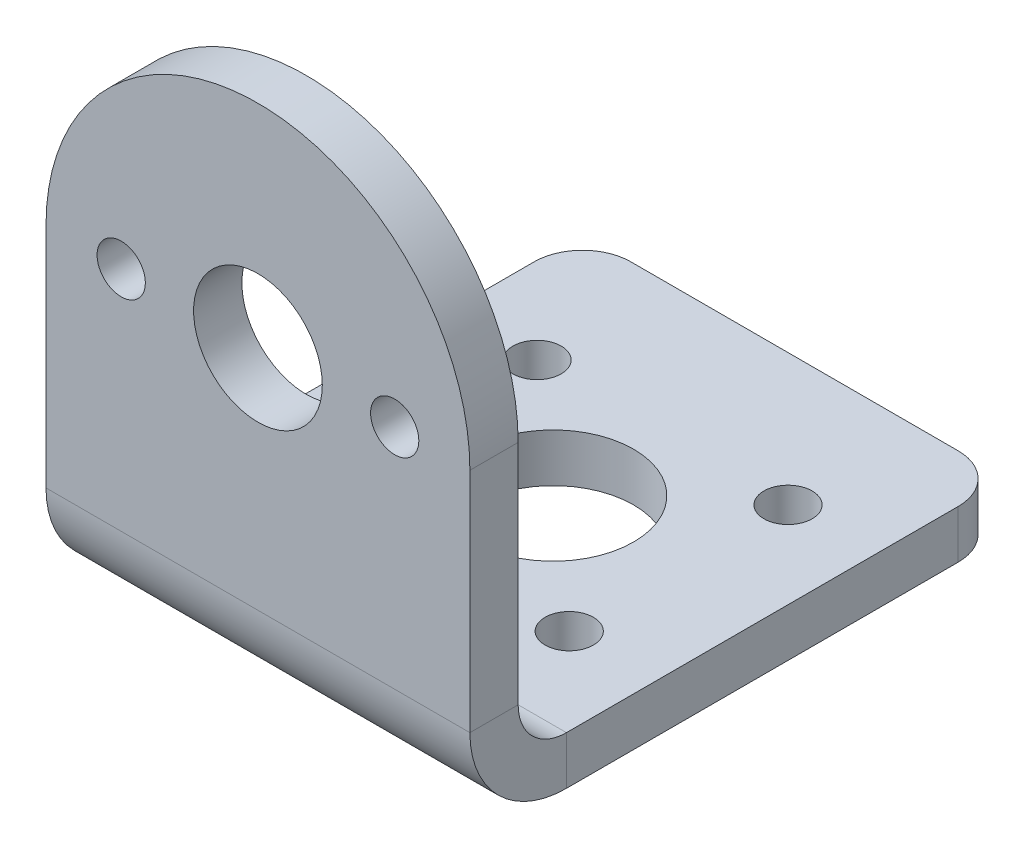
ISO-10303-21;
HEADER;
FILE_DESCRIPTION(('STEP AP214'),'2;1');
FILE_NAME('part.step','',(''),(''),'','','');
FILE_SCHEMA(('AUTOMOTIVE_DESIGN { 1 0 10303 214 1 1 1 1 }'));
ENDSEC;
DATA;
#1=APPLICATION_CONTEXT('core data for automotive mechanical design processes');
#2=APPLICATION_PROTOCOL_DEFINITION('international standard','automotive_design',2000,#1);
#3=PRODUCT_CONTEXT('',#1,'mechanical');
#4=PRODUCT('Part','Part','',(#3));
#5=PRODUCT_RELATED_PRODUCT_CATEGORY('part','',(#4));
#6=PRODUCT_DEFINITION_FORMATION('','',#4);
#7=PRODUCT_DEFINITION_CONTEXT('part definition',#1,'design');
#8=PRODUCT_DEFINITION('design','',#6,#7);
#9=PRODUCT_DEFINITION_SHAPE('','',#8);
#10=(LENGTH_UNIT() NAMED_UNIT(*) SI_UNIT(.MILLI.,.METRE.));
#11=(NAMED_UNIT(*) PLANE_ANGLE_UNIT() SI_UNIT($,.RADIAN.));
#12=(NAMED_UNIT(*) SI_UNIT($,.STERADIAN.) SOLID_ANGLE_UNIT());
#13=UNCERTAINTY_MEASURE_WITH_UNIT(LENGTH_MEASURE(1.E-05),#10,'distance_accuracy_value','');
#14=(GEOMETRIC_REPRESENTATION_CONTEXT(3) GLOBAL_UNCERTAINTY_ASSIGNED_CONTEXT((#13)) GLOBAL_UNIT_ASSIGNED_CONTEXT((#10,
#11,#12)) REPRESENTATION_CONTEXT('',''));
#15=CARTESIAN_POINT('',(0.,0.,0.));
#16=DIRECTION('',(0.,0.,1.));
#17=DIRECTION('',(1.,0.,0.));
#18=AXIS2_PLACEMENT_3D('',#15,#16,#17);
#19=CARTESIAN_POINT('',(0.,-5.76262106877346,0.));
#20=DIRECTION('',(0.,0.,1.));
#21=DIRECTION('',(1.,0.,0.));
#22=AXIS2_PLACEMENT_3D('',#19,#20,#21);
#23=PLANE('',#22);
#24=CARTESIAN_POINT('',(-8.5,0.,0.));
#25=DIRECTION('',(0.,0.,1.));
#26=DIRECTION('',(-1.,0.,0.));
#27=AXIS2_PLACEMENT_3D('',#24,#25,#26);
#28=CIRCLE('',#27,1.5);
#29=CARTESIAN_POINT('',(-7.,0.,0.));
#30=VERTEX_POINT('',#29);
#31=EDGE_CURVE('E410',#30,#30,#28,.T.);
#32=ORIENTED_EDGE('',*,*,#31,.T.);
#33=EDGE_LOOP('',(#32));
#34=FACE_BOUND('',#33,.T.);
#35=CARTESIAN_POINT('',(8.5,0.,0.));
#36=DIRECTION('',(0.,0.,1.));
#37=DIRECTION('',(-1.,0.,0.));
#38=AXIS2_PLACEMENT_3D('',#35,#36,#37);
#39=CIRCLE('',#38,1.5);
#40=CARTESIAN_POINT('',(10.,0.,0.));
#41=VERTEX_POINT('',#40);
#42=EDGE_CURVE('E395',#41,#41,#39,.T.);
#43=ORIENTED_EDGE('',*,*,#42,.T.);
#44=EDGE_LOOP('',(#43));
#45=FACE_BOUND('',#44,.T.);
#46=CARTESIAN_POINT('',(0.,0.,0.));
#47=DIRECTION('',(0.,0.,1.));
#48=DIRECTION('',(-1.,0.,0.));
#49=AXIS2_PLACEMENT_3D('',#46,#47,#48);
#50=CIRCLE('',#49,4.);
#51=CARTESIAN_POINT('',(4.,0.,0.));
#52=VERTEX_POINT('',#51);
#53=EDGE_CURVE('E278',#52,#52,#50,.T.);
#54=ORIENTED_EDGE('',*,*,#53,.T.);
#55=EDGE_LOOP('',(#54));
#56=FACE_BOUND('',#55,.T.);
#57=DIRECTION('',(-1.,0.,0.));
#58=VECTOR('',#57,1.);
#59=CARTESIAN_POINT('',(-6.5875,-14.125,0.));
#60=LINE('',#59,#58);
#61=CARTESIAN_POINT('',(13.175,-14.125,0.));
#62=VERTEX_POINT('',#61);
#63=CARTESIAN_POINT('',(-13.175,-14.125,0.));
#64=VERTEX_POINT('',#63);
#65=EDGE_CURVE('E309',#62,#64,#60,.T.);
#66=ORIENTED_EDGE('',*,*,#65,.T.);
#67=DIRECTION('',(0.,1.,0.));
#68=VECTOR('',#67,1.);
#69=CARTESIAN_POINT('',(-13.175,-20.125,0.));
#70=LINE('',#69,#68);
#71=CARTESIAN_POINT('',(-13.175,0.,0.));
#72=VERTEX_POINT('',#71);
#73=EDGE_CURVE('E284',#64,#72,#70,.T.);
#74=ORIENTED_EDGE('',*,*,#73,.T.);
#75=CARTESIAN_POINT('',(0.,0.,0.));
#76=DIRECTION('',(0.,0.,-1.));
#77=DIRECTION('',(-1.,0.,0.));
#78=AXIS2_PLACEMENT_3D('',#75,#76,#77);
#79=CIRCLE('',#78,13.175);
#80=CARTESIAN_POINT('',(13.175,0.,0.));
#81=VERTEX_POINT('',#80);
#82=EDGE_CURVE('E11',#72,#81,#79,.T.);
#83=ORIENTED_EDGE('',*,*,#82,.T.);
#84=DIRECTION('',(0.,-1.,0.));
#85=VECTOR('',#84,1.);
#86=CARTESIAN_POINT('',(13.175,0.,0.));
#87=LINE('',#86,#85);
#88=EDGE_CURVE('E372',#81,#62,#87,.T.);
#89=ORIENTED_EDGE('',*,*,#88,.T.);
#90=EDGE_LOOP('',(#66,#74,#83,#89));
#91=FACE_BOUND('',#90,.T.);
#92=ADVANCED_FACE('F17',(#34,#45,#56,#91),#23,.F.);
#93=CARTESIAN_POINT('',(0.,0.,0.));
#94=DIRECTION('',(0.,0.,1.));
#95=DIRECTION('',(-1.,0.,0.));
#96=AXIS2_PLACEMENT_3D('',#93,#94,#95);
#97=CYLINDRICAL_SURFACE('',#96,13.175);
#98=CARTESIAN_POINT('',(0.,0.,3.));
#99=DIRECTION('',(0.,0.,-1.));
#100=DIRECTION('',(-1.,0.,0.));
#101=AXIS2_PLACEMENT_3D('',#98,#99,#100);
#102=CIRCLE('',#101,13.175);
#103=CARTESIAN_POINT('',(-13.175,0.,3.));
#104=VERTEX_POINT('',#103);
#105=CARTESIAN_POINT('',(13.175,0.,3.));
#106=VERTEX_POINT('',#105);
#107=EDGE_CURVE('E283',#104,#106,#102,.T.);
#108=ORIENTED_EDGE('',*,*,#107,.T.);
#109=DIRECTION('',(0.,0.,1.));
#110=VECTOR('',#109,1.);
#111=CARTESIAN_POINT('',(13.175,0.,0.));
#112=LINE('',#111,#110);
#113=EDGE_CURVE('E28',#81,#106,#112,.T.);
#114=ORIENTED_EDGE('',*,*,#113,.F.);
#115=ORIENTED_EDGE('',*,*,#82,.F.);
#116=DIRECTION('',(0.,0.,1.));
#117=VECTOR('',#116,1.);
#118=CARTESIAN_POINT('',(-13.175,0.,0.));
#119=LINE('',#118,#117);
#120=EDGE_CURVE('E342',#72,#104,#119,.T.);
#121=ORIENTED_EDGE('',*,*,#120,.T.);
#122=EDGE_LOOP('',(#108,#114,#115,#121));
#123=FACE_BOUND('',#122,.T.);
#124=ADVANCED_FACE('F546',(#123),#97,.T.);
#125=CARTESIAN_POINT('',(13.175,0.,0.));
#126=DIRECTION('',(1.,0.,0.));
#127=DIRECTION('',(0.,1.,0.));
#128=AXIS2_PLACEMENT_3D('',#125,#126,#127);
#129=PLANE('',#128);
#130=DIRECTION('',(0.,0.,-1.));
#131=VECTOR('',#130,1.);
#132=CARTESIAN_POINT('',(13.175,-14.125,0.));
#133=LINE('',#132,#131);
#134=CARTESIAN_POINT('',(13.175,-14.125,3.));
#135=VERTEX_POINT('',#134);
#136=EDGE_CURVE('E314',#135,#62,#133,.T.);
#137=ORIENTED_EDGE('',*,*,#136,.T.);
#138=ORIENTED_EDGE('',*,*,#88,.F.);
#139=ORIENTED_EDGE('',*,*,#113,.T.);
#140=DIRECTION('',(0.,-1.,0.));
#141=VECTOR('',#140,1.);
#142=CARTESIAN_POINT('',(13.175,0.,3.));
#143=LINE('',#142,#141);
#144=EDGE_CURVE('E280',#106,#135,#143,.T.);
#145=ORIENTED_EDGE('',*,*,#144,.T.);
#146=EDGE_LOOP('',(#137,#138,#139,#145));
#147=FACE_BOUND('',#146,.T.);
#148=ADVANCED_FACE('F551',(#147),#129,.T.);
#149=CARTESIAN_POINT('',(-8.5,0.,0.));
#150=DIRECTION('',(0.,0.,1.));
#151=DIRECTION('',(-1.,0.,0.));
#152=AXIS2_PLACEMENT_3D('',#149,#150,#151);
#153=CYLINDRICAL_SURFACE('',#152,1.5);
#154=ORIENTED_EDGE('',*,*,#31,.F.);
#155=DIRECTION('',(0.,0.,1.));
#156=VECTOR('',#155,1.);
#157=CARTESIAN_POINT('',(-7.,0.,0.));
#158=LINE('',#157,#156);
#159=CARTESIAN_POINT('',(-7.,0.,3.));
#160=VERTEX_POINT('',#159);
#161=EDGE_CURVE('E121',#30,#160,#158,.T.);
#162=ORIENTED_EDGE('',*,*,#161,.T.);
#163=CARTESIAN_POINT('',(-8.5,0.,3.));
#164=DIRECTION('',(0.,0.,-1.));
#165=DIRECTION('',(-1.,0.,0.));
#166=AXIS2_PLACEMENT_3D('',#163,#164,#165);
#167=CIRCLE('',#166,1.5);
#168=EDGE_CURVE('E290',#160,#160,#167,.T.);
#169=ORIENTED_EDGE('',*,*,#168,.F.);
#170=ORIENTED_EDGE('',*,*,#161,.F.);
#171=EDGE_LOOP('',(#154,#162,#169,#170));
#172=FACE_BOUND('',#171,.T.);
#173=ADVANCED_FACE('F570',(#172),#153,.F.);
#174=CARTESIAN_POINT('',(8.5,0.,0.));
#175=DIRECTION('',(0.,0.,1.));
#176=DIRECTION('',(-1.,0.,0.));
#177=AXIS2_PLACEMENT_3D('',#174,#175,#176);
#178=CYLINDRICAL_SURFACE('',#177,1.5);
#179=ORIENTED_EDGE('',*,*,#42,.F.);
#180=DIRECTION('',(0.,0.,1.));
#181=VECTOR('',#180,1.);
#182=CARTESIAN_POINT('',(10.,0.,0.));
#183=LINE('',#182,#181);
#184=CARTESIAN_POINT('',(10.,0.,3.));
#185=VERTEX_POINT('',#184);
#186=EDGE_CURVE('E415',#41,#185,#183,.T.);
#187=ORIENTED_EDGE('',*,*,#186,.T.);
#188=CARTESIAN_POINT('',(8.5,0.,3.));
#189=DIRECTION('',(0.,0.,-1.));
#190=DIRECTION('',(-1.,0.,0.));
#191=AXIS2_PLACEMENT_3D('',#188,#189,#190);
#192=CIRCLE('',#191,1.5);
#193=EDGE_CURVE('E285',#185,#185,#192,.T.);
#194=ORIENTED_EDGE('',*,*,#193,.F.);
#195=ORIENTED_EDGE('',*,*,#186,.F.);
#196=EDGE_LOOP('',(#179,#187,#194,#195));
#197=FACE_BOUND('',#196,.T.);
#198=ADVANCED_FACE('F566',(#197),#178,.F.);
#199=CARTESIAN_POINT('',(0.,0.,0.));
#200=DIRECTION('',(0.,0.,1.));
#201=DIRECTION('',(-1.,0.,0.));
#202=AXIS2_PLACEMENT_3D('',#199,#200,#201);
#203=CYLINDRICAL_SURFACE('',#202,4.);
#204=ORIENTED_EDGE('',*,*,#53,.F.);
#205=DIRECTION('',(0.,0.,1.));
#206=VECTOR('',#205,1.);
#207=CARTESIAN_POINT('',(4.,0.,0.));
#208=LINE('',#207,#206);
#209=CARTESIAN_POINT('',(4.,0.,3.));
#210=VERTEX_POINT('',#209);
#211=EDGE_CURVE('E392',#52,#210,#208,.T.);
#212=ORIENTED_EDGE('',*,*,#211,.T.);
#213=CARTESIAN_POINT('',(0.,0.,3.));
#214=DIRECTION('',(0.,0.,-1.));
#215=DIRECTION('',(-1.,0.,0.));
#216=AXIS2_PLACEMENT_3D('',#213,#214,#215);
#217=CIRCLE('',#216,4.);
#218=EDGE_CURVE('E289',#210,#210,#217,.T.);
#219=ORIENTED_EDGE('',*,*,#218,.F.);
#220=ORIENTED_EDGE('',*,*,#211,.F.);
#221=EDGE_LOOP('',(#204,#212,#219,#220));
#222=FACE_BOUND('',#221,.T.);
#223=ADVANCED_FACE('F569',(#222),#203,.F.);
#224=CARTESIAN_POINT('',(0.,-5.76262106877346,3.));
#225=DIRECTION('',(0.,0.,1.));
#226=DIRECTION('',(1.,0.,0.));
#227=AXIS2_PLACEMENT_3D('',#224,#225,#226);
#228=PLANE('',#227);
#229=ORIENTED_EDGE('',*,*,#218,.T.);
#230=EDGE_LOOP('',(#229));
#231=FACE_BOUND('',#230,.T.);
#232=ORIENTED_EDGE('',*,*,#193,.T.);
#233=EDGE_LOOP('',(#232));
#234=FACE_BOUND('',#233,.T.);
#235=ORIENTED_EDGE('',*,*,#168,.T.);
#236=EDGE_LOOP('',(#235));
#237=FACE_BOUND('',#236,.T.);
#238=DIRECTION('',(1.,0.,0.));
#239=VECTOR('',#238,1.);
#240=CARTESIAN_POINT('',(-6.5875,-14.125,3.));
#241=LINE('',#240,#239);
#242=CARTESIAN_POINT('',(-13.175,-14.125,3.));
#243=VERTEX_POINT('',#242);
#244=EDGE_CURVE('E368',#243,#135,#241,.T.);
#245=ORIENTED_EDGE('',*,*,#244,.T.);
#246=ORIENTED_EDGE('',*,*,#144,.F.);
#247=ORIENTED_EDGE('',*,*,#107,.F.);
#248=DIRECTION('',(0.,1.,0.));
#249=VECTOR('',#248,1.);
#250=CARTESIAN_POINT('',(-13.175,-20.125,3.));
#251=LINE('',#250,#249);
#252=EDGE_CURVE('E349',#243,#104,#251,.T.);
#253=ORIENTED_EDGE('',*,*,#252,.F.);
#254=EDGE_LOOP('',(#245,#246,#247,#253));
#255=FACE_BOUND('',#254,.T.);
#256=ADVANCED_FACE('F705',(#231,#234,#237,#255),#228,.T.);
#257=CARTESIAN_POINT('',(-13.175,-20.125,0.));
#258=DIRECTION('',(-1.,0.,0.));
#259=DIRECTION('',(0.,0.,1.));
#260=AXIS2_PLACEMENT_3D('',#257,#258,#259);
#261=PLANE('',#260);
#262=DIRECTION('',(0.,0.,1.));
#263=VECTOR('',#262,1.);
#264=CARTESIAN_POINT('',(-13.175,-14.125,0.));
#265=LINE('',#264,#263);
#266=EDGE_CURVE('E310',#64,#243,#265,.T.);
#267=ORIENTED_EDGE('',*,*,#266,.T.);
#268=ORIENTED_EDGE('',*,*,#252,.T.);
#269=ORIENTED_EDGE('',*,*,#120,.F.);
#270=ORIENTED_EDGE('',*,*,#73,.F.);
#271=EDGE_LOOP('',(#267,#268,#269,#270));
#272=FACE_BOUND('',#271,.T.);
#273=ADVANCED_FACE('F521',(#272),#261,.T.);
#274=CARTESIAN_POINT('',(0.,-14.125,-3.));
#275=DIRECTION('',(1.,0.,0.));
#276=DIRECTION('',(0.,0.,1.));
#277=AXIS2_PLACEMENT_3D('',#274,#275,#276);
#278=CYLINDRICAL_SURFACE('',#277,3.);
#279=DIRECTION('',(1.,0.,0.));
#280=VECTOR('',#279,1.);
#281=CARTESIAN_POINT('',(0.,-17.125,-3.));
#282=LINE('',#281,#280);
#283=CARTESIAN_POINT('',(-13.175,-17.125,-3.));
#284=VERTEX_POINT('',#283);
#285=CARTESIAN_POINT('',(13.175,-17.125,-3.));
#286=VERTEX_POINT('',#285);
#287=EDGE_CURVE('E252',#284,#286,#282,.T.);
#288=ORIENTED_EDGE('',*,*,#287,.F.);
#289=CARTESIAN_POINT('',(-13.175,-14.125,-3.));
#290=DIRECTION('',(1.,0.,0.));
#291=DIRECTION('',(0.,0.,1.));
#292=AXIS2_PLACEMENT_3D('',#289,#290,#291);
#293=CIRCLE('',#292,3.);
#294=EDGE_CURVE('E149',#64,#284,#293,.T.);
#295=ORIENTED_EDGE('',*,*,#294,.F.);
#296=ORIENTED_EDGE('',*,*,#65,.F.);
#297=CARTESIAN_POINT('',(13.175,-14.125,-3.));
#298=DIRECTION('',(1.,0.,0.));
#299=DIRECTION('',(0.,0.,1.));
#300=AXIS2_PLACEMENT_3D('',#297,#298,#299);
#301=CIRCLE('',#300,3.);
#302=EDGE_CURVE('E311',#62,#286,#301,.T.);
#303=ORIENTED_EDGE('',*,*,#302,.T.);
#304=EDGE_LOOP('',(#288,#295,#296,#303));
#305=FACE_BOUND('',#304,.T.);
#306=ADVANCED_FACE('F506',(#305),#278,.F.);
#307=CARTESIAN_POINT('',(0.,-20.125,-13.282079934123));
#308=DIRECTION('',(0.,-1.,0.));
#309=DIRECTION('',(-1.,0.,0.));
#310=AXIS2_PLACEMENT_3D('',#307,#308,#309);
#311=PLANE('',#310);
#312=CARTESIAN_POINT('',(-7.8,-20.125,-8.55));
#313=DIRECTION('',(0.,1.,0.));
#314=DIRECTION('',(1.,0.,0.));
#315=AXIS2_PLACEMENT_3D('',#312,#313,#314);
#316=CIRCLE('',#315,1.5);
#317=CARTESIAN_POINT('',(-6.3,-20.125,-8.55));
#318=VERTEX_POINT('',#317);
#319=CARTESIAN_POINT('',(-9.3,-20.125,-8.55));
#320=VERTEX_POINT('',#319);
#321=EDGE_CURVE('E403',#318,#320,#316,.T.);
#322=ORIENTED_EDGE('',*,*,#321,.T.);
#323=CARTESIAN_POINT('',(-7.8,-20.125,-8.55));
#324=DIRECTION('',(0.,1.,0.));
#325=DIRECTION('',(1.,0.,0.));
#326=AXIS2_PLACEMENT_3D('',#323,#324,#325);
#327=CIRCLE('',#326,1.5);
#328=EDGE_CURVE('E436',#320,#318,#327,.T.);
#329=ORIENTED_EDGE('',*,*,#328,.T.);
#330=EDGE_LOOP('',(#322,#329));
#331=FACE_BOUND('',#330,.T.);
#332=CARTESIAN_POINT('',(7.8,-20.125,-22.15));
#333=DIRECTION('',(0.,1.,0.));
#334=DIRECTION('',(1.,0.,0.));
#335=AXIS2_PLACEMENT_3D('',#332,#333,#334);
#336=CIRCLE('',#335,1.5);
#337=CARTESIAN_POINT('',(9.3,-20.125,-22.15));
#338=VERTEX_POINT('',#337);
#339=CARTESIAN_POINT('',(6.3,-20.125,-22.15));
#340=VERTEX_POINT('',#339);
#341=EDGE_CURVE('E321',#338,#340,#336,.T.);
#342=ORIENTED_EDGE('',*,*,#341,.T.);
#343=CARTESIAN_POINT('',(7.8,-20.125,-22.15));
#344=DIRECTION('',(0.,1.,0.));
#345=DIRECTION('',(1.,0.,0.));
#346=AXIS2_PLACEMENT_3D('',#343,#344,#345);
#347=CIRCLE('',#346,1.5);
#348=EDGE_CURVE('E325',#340,#338,#347,.T.);
#349=ORIENTED_EDGE('',*,*,#348,.T.);
#350=EDGE_LOOP('',(#342,#349));
#351=FACE_BOUND('',#350,.T.);
#352=CARTESIAN_POINT('',(-7.8,-20.125,-22.15));
#353=DIRECTION('',(0.,1.,0.));
#354=DIRECTION('',(1.,0.,0.));
#355=AXIS2_PLACEMENT_3D('',#352,#353,#354);
#356=CIRCLE('',#355,1.5);
#357=CARTESIAN_POINT('',(-6.3,-20.125,-22.15));
#358=VERTEX_POINT('',#357);
#359=CARTESIAN_POINT('',(-9.3,-20.125,-22.15));
#360=VERTEX_POINT('',#359);
#361=EDGE_CURVE('E300',#358,#360,#356,.T.);
#362=ORIENTED_EDGE('',*,*,#361,.T.);
#363=CARTESIAN_POINT('',(-7.8,-20.125,-22.15));
#364=DIRECTION('',(0.,1.,0.));
#365=DIRECTION('',(1.,0.,0.));
#366=AXIS2_PLACEMENT_3D('',#363,#364,#365);
#367=CIRCLE('',#366,1.5);
#368=EDGE_CURVE('E296',#360,#358,#367,.T.);
#369=ORIENTED_EDGE('',*,*,#368,.T.);
#370=EDGE_LOOP('',(#362,#369));
#371=FACE_BOUND('',#370,.T.);
#372=CARTESIAN_POINT('',(7.8,-20.125,-8.55));
#373=DIRECTION('',(0.,1.,0.));
#374=DIRECTION('',(1.,0.,0.));
#375=AXIS2_PLACEMENT_3D('',#372,#373,#374);
#376=CIRCLE('',#375,1.5);
#377=CARTESIAN_POINT('',(9.3,-20.125,-8.55));
#378=VERTEX_POINT('',#377);
#379=CARTESIAN_POINT('',(6.3,-20.125,-8.55));
#380=VERTEX_POINT('',#379);
#381=EDGE_CURVE('E338',#378,#380,#376,.T.);
#382=ORIENTED_EDGE('',*,*,#381,.T.);
#383=CARTESIAN_POINT('',(7.8,-20.125,-8.55));
#384=DIRECTION('',(0.,1.,0.));
#385=DIRECTION('',(1.,0.,0.));
#386=AXIS2_PLACEMENT_3D('',#383,#384,#385);
#387=CIRCLE('',#386,1.5);
#388=EDGE_CURVE('E334',#380,#378,#387,.T.);
#389=ORIENTED_EDGE('',*,*,#388,.T.);
#390=EDGE_LOOP('',(#382,#389));
#391=FACE_BOUND('',#390,.T.);
#392=CARTESIAN_POINT('',(0.,-20.125,-15.35));
#393=DIRECTION('',(0.,1.,0.));
#394=DIRECTION('',(1.,0.,0.));
#395=AXIS2_PLACEMENT_3D('',#392,#393,#394);
#396=CIRCLE('',#395,5.);
#397=CARTESIAN_POINT('',(5.,-20.125,-15.35));
#398=VERTEX_POINT('',#397);
#399=CARTESIAN_POINT('',(-5.,-20.125,-15.35));
#400=VERTEX_POINT('',#399);
#401=EDGE_CURVE('E301',#398,#400,#396,.T.);
#402=ORIENTED_EDGE('',*,*,#401,.T.);
#403=CARTESIAN_POINT('',(0.,-20.125,-15.35));
#404=DIRECTION('',(0.,1.,0.));
#405=DIRECTION('',(1.,0.,0.));
#406=AXIS2_PLACEMENT_3D('',#403,#404,#405);
#407=CIRCLE('',#406,5.);
#408=EDGE_CURVE('E305',#400,#398,#407,.T.);
#409=ORIENTED_EDGE('',*,*,#408,.T.);
#410=EDGE_LOOP('',(#402,#409));
#411=FACE_BOUND('',#410,.T.);
#412=CARTESIAN_POINT('',(-10.175,-20.125,-27.35));
#413=DIRECTION('',(0.,1.,0.));
#414=DIRECTION('',(-0.707106781186549,0.,-0.707106781186546));
#415=AXIS2_PLACEMENT_3D('',#412,#413,#414);
#416=CIRCLE('',#415,3.);
#417=CARTESIAN_POINT('',(-10.175,-20.125,-30.35));
#418=VERTEX_POINT('',#417);
#419=CARTESIAN_POINT('',(-13.175,-20.125,-27.35));
#420=VERTEX_POINT('',#419);
#421=EDGE_CURVE('E268',#418,#420,#416,.T.);
#422=ORIENTED_EDGE('',*,*,#421,.F.);
#423=DIRECTION('',(-1.,0.,0.));
#424=VECTOR('',#423,1.);
#425=CARTESIAN_POINT('',(13.175,-20.125,-30.35));
#426=LINE('',#425,#424);
#427=CARTESIAN_POINT('',(10.175,-20.125,-30.35));
#428=VERTEX_POINT('',#427);
#429=EDGE_CURVE('E253',#428,#418,#426,.T.);
#430=ORIENTED_EDGE('',*,*,#429,.F.);
#431=CARTESIAN_POINT('',(10.175,-20.125,-27.35));
#432=DIRECTION('',(0.,1.,0.));
#433=DIRECTION('',(0.707106781186548,0.,-0.707106781186547));
#434=AXIS2_PLACEMENT_3D('',#431,#432,#433);
#435=CIRCLE('',#434,3.);
#436=CARTESIAN_POINT('',(13.175,-20.125,-27.35));
#437=VERTEX_POINT('',#436);
#438=EDGE_CURVE('E163',#437,#428,#435,.T.);
#439=ORIENTED_EDGE('',*,*,#438,.F.);
#440=DIRECTION('',(0.,0.,-1.));
#441=VECTOR('',#440,1.);
#442=CARTESIAN_POINT('',(13.175,-20.125,-3.));
#443=LINE('',#442,#441);
#444=CARTESIAN_POINT('',(13.175,-20.125,-3.));
#445=VERTEX_POINT('',#444);
#446=EDGE_CURVE('E319',#445,#437,#443,.T.);
#447=ORIENTED_EDGE('',*,*,#446,.F.);
#448=DIRECTION('',(-1.,0.,0.));
#449=VECTOR('',#448,1.);
#450=CARTESIAN_POINT('',(0.,-20.125,-3.));
#451=LINE('',#450,#449);
#452=CARTESIAN_POINT('',(-13.175,-20.125,-3.));
#453=VERTEX_POINT('',#452);
#454=EDGE_CURVE('E382',#445,#453,#451,.T.);
#455=ORIENTED_EDGE('',*,*,#454,.T.);
#456=DIRECTION('',(0.,0.,1.));
#457=VECTOR('',#456,1.);
#458=CARTESIAN_POINT('',(-13.175,-20.125,3.78584013175395));
#459=LINE('',#458,#457);
#460=EDGE_CURVE('E367',#420,#453,#459,.T.);
#461=ORIENTED_EDGE('',*,*,#460,.F.);
#462=EDGE_LOOP('',(#422,#430,#439,#447,#455,#461));
#463=FACE_BOUND('',#462,.T.);
#464=ADVANCED_FACE('F19',(#331,#351,#371,#391,#411,#463),#311,.T.);
#465=CARTESIAN_POINT('',(-13.175,-20.125,-3.));
#466=DIRECTION('',(-1.,0.,0.));
#467=DIRECTION('',(0.,0.,1.));
#468=AXIS2_PLACEMENT_3D('',#465,#466,#467);
#469=PLANE('',#468);
#470=DIRECTION('',(0.,1.,0.));
#471=VECTOR('',#470,1.);
#472=CARTESIAN_POINT('',(-13.175,-17.785,-3.));
#473=LINE('',#472,#471);
#474=EDGE_CURVE('E247',#453,#284,#473,.T.);
#475=ORIENTED_EDGE('',*,*,#474,.F.);
#476=CARTESIAN_POINT('',(-13.175,-14.125,-3.));
#477=DIRECTION('',(-1.,0.,0.));
#478=DIRECTION('',(0.,-1.,0.));
#479=AXIS2_PLACEMENT_3D('',#476,#477,#478);
#480=CIRCLE('',#479,6.);
#481=EDGE_CURVE('E363',#453,#243,#480,.T.);
#482=ORIENTED_EDGE('',*,*,#481,.T.);
#483=ORIENTED_EDGE('',*,*,#266,.F.);
#484=ORIENTED_EDGE('',*,*,#294,.T.);
#485=EDGE_LOOP('',(#475,#482,#483,#484));
#486=FACE_BOUND('',#485,.T.);
#487=ADVANCED_FACE('F505',(#486),#469,.T.);
#488=CARTESIAN_POINT('',(13.175,-17.125,-3.));
#489=DIRECTION('',(1.,0.,0.));
#490=DIRECTION('',(0.,1.,0.));
#491=AXIS2_PLACEMENT_3D('',#488,#489,#490);
#492=PLANE('',#491);
#493=DIRECTION('',(0.,-1.,0.));
#494=VECTOR('',#493,1.);
#495=CARTESIAN_POINT('',(13.175,-17.785,-3.));
#496=LINE('',#495,#494);
#497=EDGE_CURVE('E315',#286,#445,#496,.T.);
#498=ORIENTED_EDGE('',*,*,#497,.F.);
#499=ORIENTED_EDGE('',*,*,#302,.F.);
#500=ORIENTED_EDGE('',*,*,#136,.F.);
#501=CARTESIAN_POINT('',(13.175,-14.125,-3.));
#502=DIRECTION('',(1.,0.,0.));
#503=DIRECTION('',(0.,0.,1.));
#504=AXIS2_PLACEMENT_3D('',#501,#502,#503);
#505=CIRCLE('',#504,6.);
#506=EDGE_CURVE('E378',#135,#445,#505,.T.);
#507=ORIENTED_EDGE('',*,*,#506,.T.);
#508=EDGE_LOOP('',(#498,#499,#500,#507));
#509=FACE_BOUND('',#508,.T.);
#510=ADVANCED_FACE('F816',(#509),#492,.T.);
#511=CARTESIAN_POINT('',(-13.175,-17.125,-3.));
#512=DIRECTION('',(-1.,0.,0.));
#513=DIRECTION('',(0.,1.,0.));
#514=AXIS2_PLACEMENT_3D('',#511,#512,#513);
#515=PLANE('',#514);
#516=DIRECTION('',(0.,1.,0.));
#517=VECTOR('',#516,1.);
#518=CARTESIAN_POINT('',(-13.175,-17.125,-27.35));
#519=LINE('',#518,#517);
#520=CARTESIAN_POINT('',(-13.175,-17.125,-27.35));
#521=VERTEX_POINT('',#520);
#522=EDGE_CURVE('E245',#420,#521,#519,.T.);
#523=ORIENTED_EDGE('',*,*,#522,.F.);
#524=ORIENTED_EDGE('',*,*,#460,.T.);
#525=ORIENTED_EDGE('',*,*,#474,.T.);
#526=DIRECTION('',(0.,0.,-1.));
#527=VECTOR('',#526,1.);
#528=CARTESIAN_POINT('',(-13.175,-17.125,3.78584013175395));
#529=LINE('',#528,#527);
#530=EDGE_CURVE('E240',#284,#521,#529,.T.);
#531=ORIENTED_EDGE('',*,*,#530,.T.);
#532=EDGE_LOOP('',(#523,#524,#525,#531));
#533=FACE_BOUND('',#532,.T.);
#534=ADVANCED_FACE('F242',(#533),#515,.T.);
#535=CARTESIAN_POINT('',(0.,-14.125,-3.));
#536=DIRECTION('',(1.,0.,0.));
#537=DIRECTION('',(0.,0.,1.));
#538=AXIS2_PLACEMENT_3D('',#535,#536,#537);
#539=CYLINDRICAL_SURFACE('',#538,6.);
#540=ORIENTED_EDGE('',*,*,#454,.F.);
#541=ORIENTED_EDGE('',*,*,#506,.F.);
#542=ORIENTED_EDGE('',*,*,#244,.F.);
#543=ORIENTED_EDGE('',*,*,#481,.F.);
#544=EDGE_LOOP('',(#540,#541,#542,#543));
#545=FACE_BOUND('',#544,.T.);
#546=ADVANCED_FACE('F518',(#545),#539,.T.);
#547=CARTESIAN_POINT('',(-7.8,-18.625,-8.55));
#548=DIRECTION('',(0.,1.,0.));
#549=DIRECTION('',(1.,0.,0.));
#550=AXIS2_PLACEMENT_3D('',#547,#548,#549);
#551=CYLINDRICAL_SURFACE('',#550,1.5);
#552=CARTESIAN_POINT('',(-7.8,-17.125,-8.55));
#553=DIRECTION('',(0.,-1.,0.));
#554=DIRECTION('',(1.,0.,0.));
#555=AXIS2_PLACEMENT_3D('',#552,#553,#554);
#556=CIRCLE('',#555,1.5);
#557=CARTESIAN_POINT('',(-6.3,-17.125,-8.55));
#558=VERTEX_POINT('',#557);
#559=CARTESIAN_POINT('',(-9.3,-17.125,-8.55));
#560=VERTEX_POINT('',#559);
#561=EDGE_CURVE('E330',#558,#560,#556,.T.);
#562=ORIENTED_EDGE('',*,*,#561,.F.);
#563=CARTESIAN_POINT('',(-7.8,-17.125,-8.55));
#564=DIRECTION('',(0.,-1.,0.));
#565=DIRECTION('',(1.,0.,0.));
#566=AXIS2_PLACEMENT_3D('',#563,#564,#565);
#567=CIRCLE('',#566,1.5);
#568=EDGE_CURVE('E339',#560,#558,#567,.T.);
#569=ORIENTED_EDGE('',*,*,#568,.F.);
#570=DIRECTION('',(0.,-1.,0.));
#571=VECTOR('',#570,1.);
#572=CARTESIAN_POINT('',(-9.3,-18.625,-8.55));
#573=LINE('',#572,#571);
#574=EDGE_CURVE('E399',#560,#320,#573,.T.);
#575=ORIENTED_EDGE('',*,*,#574,.T.);
#576=ORIENTED_EDGE('',*,*,#321,.F.);
#577=ORIENTED_EDGE('',*,*,#328,.F.);
#578=ORIENTED_EDGE('',*,*,#574,.F.);
#579=EDGE_LOOP('',(#562,#569,#575,#576,#577,#578));
#580=FACE_BOUND('',#579,.T.);
#581=ADVANCED_FACE('F574',(#580),#551,.F.);
#582=CARTESIAN_POINT('',(7.8,-18.625,-22.15));
#583=DIRECTION('',(0.,1.,0.));
#584=DIRECTION('',(1.,0.,0.));
#585=AXIS2_PLACEMENT_3D('',#582,#583,#584);
#586=CYLINDRICAL_SURFACE('',#585,1.5);
#587=CARTESIAN_POINT('',(7.8,-17.125,-22.15));
#588=DIRECTION('',(0.,-1.,0.));
#589=DIRECTION('',(1.,0.,0.));
#590=AXIS2_PLACEMENT_3D('',#587,#588,#589);
#591=CIRCLE('',#590,1.5);
#592=CARTESIAN_POINT('',(9.3,-17.125,-22.15));
#593=VERTEX_POINT('',#592);
#594=CARTESIAN_POINT('',(6.3,-17.125,-22.15));
#595=VERTEX_POINT('',#594);
#596=EDGE_CURVE('E331',#593,#595,#591,.T.);
#597=ORIENTED_EDGE('',*,*,#596,.F.);
#598=CARTESIAN_POINT('',(7.8,-17.125,-22.15));
#599=DIRECTION('',(0.,-1.,0.));
#600=DIRECTION('',(1.,0.,0.));
#601=AXIS2_PLACEMENT_3D('',#598,#599,#600);
#602=CIRCLE('',#601,1.5);
#603=EDGE_CURVE('E326',#595,#593,#602,.T.);
#604=ORIENTED_EDGE('',*,*,#603,.F.);
#605=DIRECTION('',(0.,-1.,0.));
#606=VECTOR('',#605,1.);
#607=CARTESIAN_POINT('',(6.3,-18.625,-22.15));
#608=LINE('',#607,#606);
#609=EDGE_CURVE('E299',#595,#340,#608,.T.);
#610=ORIENTED_EDGE('',*,*,#609,.T.);
#611=ORIENTED_EDGE('',*,*,#341,.F.);
#612=ORIENTED_EDGE('',*,*,#348,.F.);
#613=ORIENTED_EDGE('',*,*,#609,.F.);
#614=EDGE_LOOP('',(#597,#604,#610,#611,#612,#613));
#615=FACE_BOUND('',#614,.T.);
#616=ADVANCED_FACE('F575',(#615),#586,.F.);
#617=CARTESIAN_POINT('',(-7.8,-18.625,-22.15));
#618=DIRECTION('',(0.,1.,0.));
#619=DIRECTION('',(1.,0.,0.));
#620=AXIS2_PLACEMENT_3D('',#617,#618,#619);
#621=CYLINDRICAL_SURFACE('',#620,1.5);
#622=CARTESIAN_POINT('',(-7.8,-17.125,-22.15));
#623=DIRECTION('',(0.,-1.,0.));
#624=DIRECTION('',(1.,0.,0.));
#625=AXIS2_PLACEMENT_3D('',#622,#623,#624);
#626=CIRCLE('',#625,1.5);
#627=CARTESIAN_POINT('',(-6.3,-17.125,-22.15));
#628=VERTEX_POINT('',#627);
#629=CARTESIAN_POINT('',(-9.3,-17.125,-22.15));
#630=VERTEX_POINT('',#629);
#631=EDGE_CURVE('E384',#628,#630,#626,.T.);
#632=ORIENTED_EDGE('',*,*,#631,.F.);
#633=CARTESIAN_POINT('',(-7.8,-17.125,-22.15));
#634=DIRECTION('',(0.,-1.,0.));
#635=DIRECTION('',(1.,0.,0.));
#636=AXIS2_PLACEMENT_3D('',#633,#634,#635);
#637=CIRCLE('',#636,1.5);
#638=EDGE_CURVE('E388',#630,#628,#637,.T.);
#639=ORIENTED_EDGE('',*,*,#638,.F.);
#640=DIRECTION('',(0.,-1.,0.));
#641=VECTOR('',#640,1.);
#642=CARTESIAN_POINT('',(-9.3,-18.625,-22.15));
#643=LINE('',#642,#641);
#644=EDGE_CURVE('E337',#630,#360,#643,.T.);
#645=ORIENTED_EDGE('',*,*,#644,.T.);
#646=ORIENTED_EDGE('',*,*,#361,.F.);
#647=ORIENTED_EDGE('',*,*,#368,.F.);
#648=ORIENTED_EDGE('',*,*,#644,.F.);
#649=EDGE_LOOP('',(#632,#639,#645,#646,#647,#648));
#650=FACE_BOUND('',#649,.T.);
#651=ADVANCED_FACE('F501',(#650),#621,.F.);
#652=CARTESIAN_POINT('',(7.8,-18.625,-8.55));
#653=DIRECTION('',(0.,1.,0.));
#654=DIRECTION('',(1.,0.,0.));
#655=AXIS2_PLACEMENT_3D('',#652,#653,#654);
#656=CYLINDRICAL_SURFACE('',#655,1.5);
#657=CARTESIAN_POINT('',(7.8,-17.125,-8.55));
#658=DIRECTION('',(0.,-1.,0.));
#659=DIRECTION('',(1.,0.,0.));
#660=AXIS2_PLACEMENT_3D('',#657,#658,#659);
#661=CIRCLE('',#660,1.5);
#662=CARTESIAN_POINT('',(9.3,-17.125,-8.55));
#663=VERTEX_POINT('',#662);
#664=CARTESIAN_POINT('',(6.3,-17.125,-8.55));
#665=VERTEX_POINT('',#664);
#666=EDGE_CURVE('E429',#663,#665,#661,.T.);
#667=ORIENTED_EDGE('',*,*,#666,.F.);
#668=CARTESIAN_POINT('',(7.8,-17.125,-8.55));
#669=DIRECTION('',(0.,-1.,0.));
#670=DIRECTION('',(1.,0.,0.));
#671=AXIS2_PLACEMENT_3D('',#668,#669,#670);
#672=CIRCLE('',#671,1.5);
#673=EDGE_CURVE('E389',#665,#663,#672,.T.);
#674=ORIENTED_EDGE('',*,*,#673,.F.);
#675=DIRECTION('',(0.,-1.,0.));
#676=VECTOR('',#675,1.);
#677=CARTESIAN_POINT('',(6.3,-18.625,-8.55));
#678=LINE('',#677,#676);
#679=EDGE_CURVE('E398',#665,#380,#678,.T.);
#680=ORIENTED_EDGE('',*,*,#679,.T.);
#681=ORIENTED_EDGE('',*,*,#381,.F.);
#682=ORIENTED_EDGE('',*,*,#388,.F.);
#683=ORIENTED_EDGE('',*,*,#679,.F.);
#684=EDGE_LOOP('',(#667,#674,#680,#681,#682,#683));
#685=FACE_BOUND('',#684,.T.);
#686=ADVANCED_FACE('F560',(#685),#656,.F.);
#687=CARTESIAN_POINT('',(0.,-18.625,-15.35));
#688=DIRECTION('',(0.,1.,0.));
#689=DIRECTION('',(1.,0.,0.));
#690=AXIS2_PLACEMENT_3D('',#687,#688,#689);
#691=CYLINDRICAL_SURFACE('',#690,5.);
#692=CARTESIAN_POINT('',(0.,-17.125,-15.35));
#693=DIRECTION('',(0.,-1.,0.));
#694=DIRECTION('',(1.,0.,0.));
#695=AXIS2_PLACEMENT_3D('',#692,#693,#694);
#696=CIRCLE('',#695,5.);
#697=CARTESIAN_POINT('',(5.,-17.125,-15.35));
#698=VERTEX_POINT('',#697);
#699=CARTESIAN_POINT('',(-5.,-17.125,-15.35));
#700=VERTEX_POINT('',#699);
#701=EDGE_CURVE('E445',#698,#700,#696,.T.);
#702=ORIENTED_EDGE('',*,*,#701,.F.);
#703=CARTESIAN_POINT('',(0.,-17.125,-15.35));
#704=DIRECTION('',(0.,-1.,0.));
#705=DIRECTION('',(1.,0.,0.));
#706=AXIS2_PLACEMENT_3D('',#703,#704,#705);
#707=CIRCLE('',#706,5.);
#708=EDGE_CURVE('E424',#700,#698,#707,.T.);
#709=ORIENTED_EDGE('',*,*,#708,.F.);
#710=DIRECTION('',(0.,-1.,0.));
#711=VECTOR('',#710,1.);
#712=CARTESIAN_POINT('',(-5.,-18.625,-15.35));
#713=LINE('',#712,#711);
#714=EDGE_CURVE('E306',#700,#400,#713,.T.);
#715=ORIENTED_EDGE('',*,*,#714,.T.);
#716=ORIENTED_EDGE('',*,*,#401,.F.);
#717=ORIENTED_EDGE('',*,*,#408,.F.);
#718=ORIENTED_EDGE('',*,*,#714,.F.);
#719=EDGE_LOOP('',(#702,#709,#715,#716,#717,#718));
#720=FACE_BOUND('',#719,.T.);
#721=ADVANCED_FACE('F558',(#720),#691,.F.);
#722=CARTESIAN_POINT('',(13.175,-17.125,-3.));
#723=DIRECTION('',(1.,0.,0.));
#724=DIRECTION('',(0.,1.,0.));
#725=AXIS2_PLACEMENT_3D('',#722,#723,#724);
#726=PLANE('',#725);
#727=DIRECTION('',(0.,-1.,0.));
#728=VECTOR('',#727,1.);
#729=CARTESIAN_POINT('',(13.175,-17.125,-27.35));
#730=LINE('',#729,#728);
#731=CARTESIAN_POINT('',(13.175,-17.125,-27.35));
#732=VERTEX_POINT('',#731);
#733=EDGE_CURVE('E320',#732,#437,#730,.T.);
#734=ORIENTED_EDGE('',*,*,#733,.F.);
#735=DIRECTION('',(0.,0.,-1.));
#736=VECTOR('',#735,1.);
#737=CARTESIAN_POINT('',(13.175,-17.125,3.78584013175395));
#738=LINE('',#737,#736);
#739=EDGE_CURVE('E291',#286,#732,#738,.T.);
#740=ORIENTED_EDGE('',*,*,#739,.F.);
#741=ORIENTED_EDGE('',*,*,#497,.T.);
#742=ORIENTED_EDGE('',*,*,#446,.T.);
#743=EDGE_LOOP('',(#734,#740,#741,#742));
#744=FACE_BOUND('',#743,.T.);
#745=ADVANCED_FACE('F528',(#744),#726,.T.);
#746=CARTESIAN_POINT('',(10.175,-17.125,-27.35));
#747=DIRECTION('',(0.,-1.,0.));
#748=DIRECTION('',(0.707106781186548,0.,-0.707106781186547));
#749=AXIS2_PLACEMENT_3D('',#746,#747,#748);
#750=CYLINDRICAL_SURFACE('',#749,3.);
#751=ORIENTED_EDGE('',*,*,#438,.T.);
#752=DIRECTION('',(0.,1.,0.));
#753=VECTOR('',#752,1.);
#754=CARTESIAN_POINT('',(10.175,-17.125,-30.35));
#755=LINE('',#754,#753);
#756=CARTESIAN_POINT('',(10.175,-17.125,-30.35));
#757=VERTEX_POINT('',#756);
#758=EDGE_CURVE('E21',#428,#757,#755,.T.);
#759=ORIENTED_EDGE('',*,*,#758,.T.);
#760=CARTESIAN_POINT('',(10.175,-17.125,-27.35));
#761=DIRECTION('',(0.,-1.,0.));
#762=DIRECTION('',(0.707106781186548,0.,-0.707106781186547));
#763=AXIS2_PLACEMENT_3D('',#760,#761,#762);
#764=CIRCLE('',#763,3.);
#765=EDGE_CURVE('E295',#757,#732,#764,.T.);
#766=ORIENTED_EDGE('',*,*,#765,.T.);
#767=ORIENTED_EDGE('',*,*,#733,.T.);
#768=EDGE_LOOP('',(#751,#759,#766,#767));
#769=FACE_BOUND('',#768,.T.);
#770=ADVANCED_FACE('F529',(#769),#750,.T.);
#771=CARTESIAN_POINT('',(0.,-17.125,-13.282079934123));
#772=DIRECTION('',(0.,-1.,0.));
#773=DIRECTION('',(-1.,0.,0.));
#774=AXIS2_PLACEMENT_3D('',#771,#772,#773);
#775=PLANE('',#774);
#776=ORIENTED_EDGE('',*,*,#561,.T.);
#777=ORIENTED_EDGE('',*,*,#568,.T.);
#778=EDGE_LOOP('',(#776,#777));
#779=FACE_BOUND('',#778,.T.);
#780=ORIENTED_EDGE('',*,*,#596,.T.);
#781=ORIENTED_EDGE('',*,*,#603,.T.);
#782=EDGE_LOOP('',(#780,#781));
#783=FACE_BOUND('',#782,.T.);
#784=ORIENTED_EDGE('',*,*,#631,.T.);
#785=ORIENTED_EDGE('',*,*,#638,.T.);
#786=EDGE_LOOP('',(#784,#785));
#787=FACE_BOUND('',#786,.T.);
#788=ORIENTED_EDGE('',*,*,#666,.T.);
#789=ORIENTED_EDGE('',*,*,#673,.T.);
#790=EDGE_LOOP('',(#788,#789));
#791=FACE_BOUND('',#790,.T.);
#792=ORIENTED_EDGE('',*,*,#701,.T.);
#793=ORIENTED_EDGE('',*,*,#708,.T.);
#794=EDGE_LOOP('',(#792,#793));
#795=FACE_BOUND('',#794,.T.);
#796=CARTESIAN_POINT('',(-10.175,-17.125,-27.35));
#797=DIRECTION('',(0.,-1.,0.));
#798=DIRECTION('',(-0.707106781186549,0.,-0.707106781186546));
#799=AXIS2_PLACEMENT_3D('',#796,#797,#798);
#800=CIRCLE('',#799,3.);
#801=CARTESIAN_POINT('',(-10.175,-17.125,-30.35));
#802=VERTEX_POINT('',#801);
#803=EDGE_CURVE('E256',#521,#802,#800,.T.);
#804=ORIENTED_EDGE('',*,*,#803,.F.);
#805=ORIENTED_EDGE('',*,*,#530,.F.);
#806=ORIENTED_EDGE('',*,*,#287,.T.);
#807=ORIENTED_EDGE('',*,*,#739,.T.);
#808=ORIENTED_EDGE('',*,*,#765,.F.);
#809=DIRECTION('',(-1.,0.,0.));
#810=VECTOR('',#809,1.);
#811=CARTESIAN_POINT('',(13.175,-17.125,-30.35));
#812=LINE('',#811,#810);
#813=EDGE_CURVE('E259',#757,#802,#812,.T.);
#814=ORIENTED_EDGE('',*,*,#813,.T.);
#815=EDGE_LOOP('',(#804,#805,#806,#807,#808,#814));
#816=FACE_BOUND('',#815,.T.);
#817=ADVANCED_FACE('F257',(#779,#783,#787,#791,#795,#816),#775,.F.);
#818=CARTESIAN_POINT('',(13.175,-17.125,-30.35));
#819=DIRECTION('',(0.,0.,-1.));
#820=DIRECTION('',(0.,-1.,0.));
#821=AXIS2_PLACEMENT_3D('',#818,#819,#820);
#822=PLANE('',#821);
#823=DIRECTION('',(0.,-1.,0.));
#824=VECTOR('',#823,1.);
#825=CARTESIAN_POINT('',(-10.175,-17.125,-30.35));
#826=LINE('',#825,#824);
#827=EDGE_CURVE('E264',#802,#418,#826,.T.);
#828=ORIENTED_EDGE('',*,*,#827,.F.);
#829=ORIENTED_EDGE('',*,*,#813,.F.);
#830=ORIENTED_EDGE('',*,*,#758,.F.);
#831=ORIENTED_EDGE('',*,*,#429,.T.);
#832=EDGE_LOOP('',(#828,#829,#830,#831));
#833=FACE_BOUND('',#832,.T.);
#834=ADVANCED_FACE('F532',(#833),#822,.T.);
#835=CARTESIAN_POINT('',(-10.175,-17.125,-27.35));
#836=DIRECTION('',(0.,-1.,0.));
#837=DIRECTION('',(-0.707106781186549,0.,-0.707106781186546));
#838=AXIS2_PLACEMENT_3D('',#835,#836,#837);
#839=CYLINDRICAL_SURFACE('',#838,3.);
#840=ORIENTED_EDGE('',*,*,#421,.T.);
#841=ORIENTED_EDGE('',*,*,#522,.T.);
#842=ORIENTED_EDGE('',*,*,#803,.T.);
#843=ORIENTED_EDGE('',*,*,#827,.T.);
#844=EDGE_LOOP('',(#840,#841,#842,#843));
#845=FACE_BOUND('',#844,.T.);
#846=ADVANCED_FACE('F266',(#845),#839,.T.);
#847=CLOSED_SHELL('',(#92,#124,#148,#173,#198,#223,#256,#273,#306,#464,#487,#510,#534,#546,#581,
#616,#651,#686,#721,#745,#770,#817,#834,#846));
#848=MANIFOLD_SOLID_BREP('B1',#847);
#849=ADVANCED_BREP_SHAPE_REPRESENTATION('',(#18,#848),#14);
#850=SHAPE_DEFINITION_REPRESENTATION(#9,#849);
ENDSEC;
END-ISO-10303-21;
